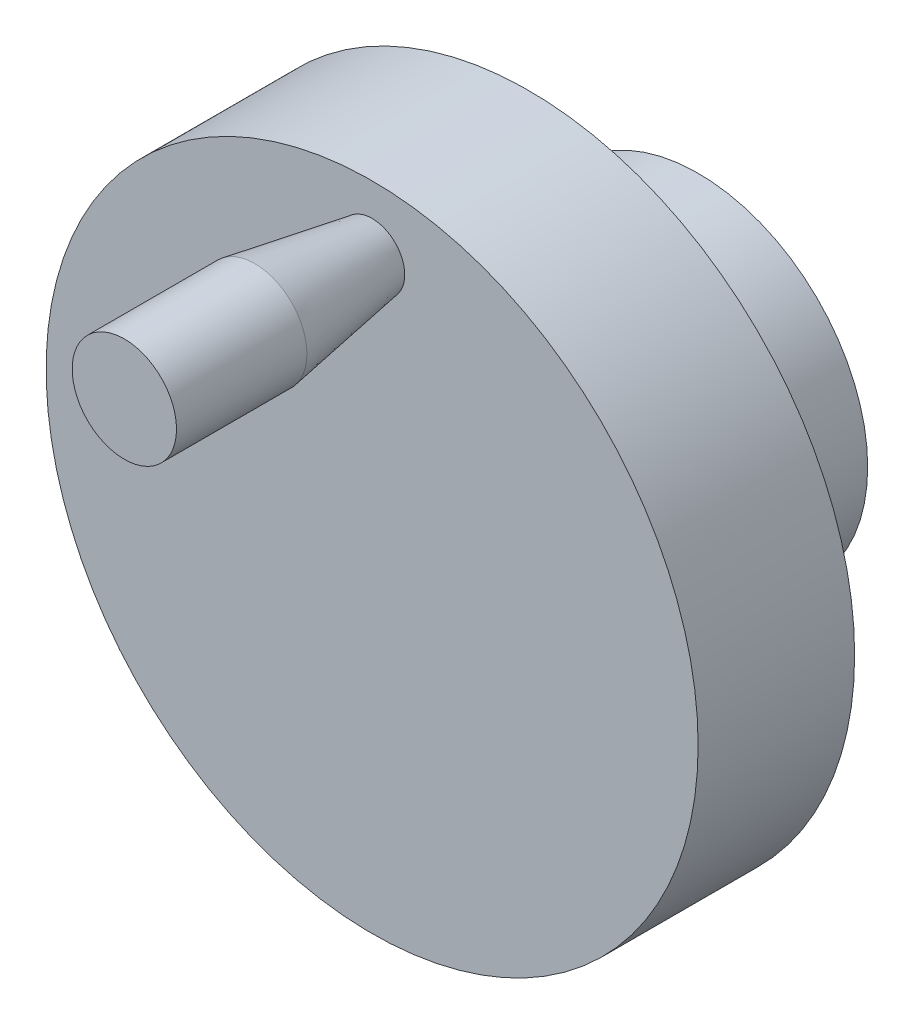
ISO-10303-21;
HEADER;
FILE_DESCRIPTION(('STEP AP214'),'2;1');
FILE_NAME('part.step','',(''),(''),'','','');
FILE_SCHEMA(('AUTOMOTIVE_DESIGN { 1 0 10303 214 1 1 1 1 }'));
ENDSEC;
DATA;
#1=APPLICATION_CONTEXT('core data for automotive mechanical design processes');
#2=APPLICATION_PROTOCOL_DEFINITION('international standard','automotive_design',2000,#1);
#3=PRODUCT_CONTEXT('',#1,'mechanical');
#4=PRODUCT('Part','Part','',(#3));
#5=PRODUCT_RELATED_PRODUCT_CATEGORY('part','',(#4));
#6=PRODUCT_DEFINITION_FORMATION('','',#4);
#7=PRODUCT_DEFINITION_CONTEXT('part definition',#1,'design');
#8=PRODUCT_DEFINITION('design','',#6,#7);
#9=PRODUCT_DEFINITION_SHAPE('','',#8);
#10=(LENGTH_UNIT() NAMED_UNIT(*) SI_UNIT(.MILLI.,.METRE.));
#11=(NAMED_UNIT(*) PLANE_ANGLE_UNIT() SI_UNIT($,.RADIAN.));
#12=(NAMED_UNIT(*) SI_UNIT($,.STERADIAN.) SOLID_ANGLE_UNIT());
#13=UNCERTAINTY_MEASURE_WITH_UNIT(LENGTH_MEASURE(1.E-05),#10,'distance_accuracy_value','');
#14=(GEOMETRIC_REPRESENTATION_CONTEXT(3) GLOBAL_UNCERTAINTY_ASSIGNED_CONTEXT((#13)) GLOBAL_UNIT_ASSIGNED_CONTEXT((#10,
#11,#12)) REPRESENTATION_CONTEXT('',''));
#15=CARTESIAN_POINT('',(0.,0.,0.));
#16=DIRECTION('',(0.,0.,1.));
#17=DIRECTION('',(1.,0.,0.));
#18=AXIS2_PLACEMENT_3D('',#15,#16,#17);
#19=CARTESIAN_POINT('',(0.,0.,12.));
#20=DIRECTION('',(0.,0.,-1.));
#21=DIRECTION('',(-1.,0.,0.));
#22=AXIS2_PLACEMENT_3D('',#19,#20,#21);
#23=CYLINDRICAL_SURFACE('',#22,25.);
#24=CARTESIAN_POINT('',(0.,0.,12.));
#25=DIRECTION('',(0.,0.,1.));
#26=DIRECTION('',(1.,0.,0.));
#27=AXIS2_PLACEMENT_3D('',#24,#25,#26);
#28=CIRCLE('',#27,25.);
#29=CARTESIAN_POINT('',(25.,0.,12.));
#30=VERTEX_POINT('',#29);
#31=EDGE_CURVE('E38',#30,#30,#28,.T.);
#32=ORIENTED_EDGE('',*,*,#31,.F.);
#33=EDGE_LOOP('',(#32));
#34=FACE_BOUND('',#33,.T.);
#35=CARTESIAN_POINT('',(0.,0.,0.));
#36=DIRECTION('',(0.,0.,1.));
#37=DIRECTION('',(1.,0.,0.));
#38=AXIS2_PLACEMENT_3D('',#35,#36,#37);
#39=CIRCLE('',#38,25.);
#40=CARTESIAN_POINT('',(25.,0.,0.));
#41=VERTEX_POINT('',#40);
#42=EDGE_CURVE('E34',#41,#41,#39,.T.);
#43=ORIENTED_EDGE('',*,*,#42,.T.);
#44=EDGE_LOOP('',(#43));
#45=FACE_BOUND('',#44,.T.);
#46=ADVANCED_FACE('F31',(#34,#45),#23,.T.);
#47=CARTESIAN_POINT('',(0.,0.,12.));
#48=DIRECTION('',(0.,0.,1.));
#49=DIRECTION('',(1.,0.,0.));
#50=AXIS2_PLACEMENT_3D('',#47,#48,#49);
#51=PLANE('',#50);
#52=CARTESIAN_POINT('',(0.,20.,12.));
#53=DIRECTION('',(0.,0.,1.));
#54=DIRECTION('',(1.,0.,0.));
#55=AXIS2_PLACEMENT_3D('',#52,#53,#54);
#56=CIRCLE('',#55,2.5);
#57=CARTESIAN_POINT('',(2.5,20.,12.));
#58=VERTEX_POINT('',#57);
#59=EDGE_CURVE('E53',#58,#58,#56,.T.);
#60=ORIENTED_EDGE('',*,*,#59,.F.);
#61=EDGE_LOOP('',(#60));
#62=FACE_BOUND('',#61,.T.);
#63=ORIENTED_EDGE('',*,*,#31,.T.);
#64=EDGE_LOOP('',(#63));
#65=FACE_BOUND('',#64,.T.);
#66=ADVANCED_FACE('F78',(#62,#65),#51,.T.);
#67=CARTESIAN_POINT('',(0.,0.,0.));
#68=DIRECTION('',(0.,0.,1.));
#69=DIRECTION('',(1.,0.,0.));
#70=AXIS2_PLACEMENT_3D('',#67,#68,#69);
#71=PLANE('',#70);
#72=CARTESIAN_POINT('',(0.,0.,0.));
#73=DIRECTION('',(0.,0.,-1.));
#74=DIRECTION('',(-1.,0.,0.));
#75=AXIS2_PLACEMENT_3D('',#72,#73,#74);
#76=CIRCLE('',#75,13.);
#77=CARTESIAN_POINT('',(13.,0.,0.));
#78=VERTEX_POINT('',#77);
#79=EDGE_CURVE('E10',#78,#78,#76,.T.);
#80=ORIENTED_EDGE('',*,*,#79,.F.);
#81=EDGE_LOOP('',(#80));
#82=FACE_BOUND('',#81,.T.);
#83=ORIENTED_EDGE('',*,*,#42,.F.);
#84=EDGE_LOOP('',(#83));
#85=FACE_BOUND('',#84,.T.);
#86=ADVANCED_FACE('F81',(#82,#85),#71,.F.);
#87=CARTESIAN_POINT('',(0.,0.,-13.));
#88=DIRECTION('',(0.,0.,1.));
#89=DIRECTION('',(1.,0.,0.));
#90=AXIS2_PLACEMENT_3D('',#87,#88,#89);
#91=CYLINDRICAL_SURFACE('',#90,13.);
#92=CARTESIAN_POINT('',(0.,0.,-13.));
#93=DIRECTION('',(0.,0.,-1.));
#94=DIRECTION('',(-1.,0.,0.));
#95=AXIS2_PLACEMENT_3D('',#92,#93,#94);
#96=CIRCLE('',#95,13.);
#97=CARTESIAN_POINT('',(13.,0.,-13.));
#98=VERTEX_POINT('',#97);
#99=EDGE_CURVE('E44',#98,#98,#96,.T.);
#100=CARTESIAN_POINT('',(13.,0.,-13.));
#101=CARTESIAN_POINT('',(13.,0.,-12.8645833333333));
#102=CARTESIAN_POINT('',(13.,0.,-12.7291666666667));
#103=CARTESIAN_POINT('',(13.,0.,-12.4583333333333));
#104=CARTESIAN_POINT('',(13.,0.,-12.3229166666667));
#105=CARTESIAN_POINT('',(13.,0.,-12.0520833333333));
#106=CARTESIAN_POINT('',(13.,0.,-11.9166666666667));
#107=CARTESIAN_POINT('',(13.,0.,-11.6458333333333));
#108=CARTESIAN_POINT('',(13.,0.,-11.5104166666667));
#109=CARTESIAN_POINT('',(13.,0.,-11.2395833333333));
#110=CARTESIAN_POINT('',(13.,0.,-11.1041666666667));
#111=CARTESIAN_POINT('',(13.,0.,-10.8333333333333));
#112=CARTESIAN_POINT('',(13.,0.,-10.6979166666667));
#113=CARTESIAN_POINT('',(13.,0.,-10.4270833333333));
#114=CARTESIAN_POINT('',(13.,0.,-10.2916666666667));
#115=CARTESIAN_POINT('',(13.,0.,-10.0208333333333));
#116=CARTESIAN_POINT('',(13.,0.,-9.88541666666667));
#117=CARTESIAN_POINT('',(13.,0.,-9.61458333333333));
#118=CARTESIAN_POINT('',(13.,0.,-9.47916666666667));
#119=CARTESIAN_POINT('',(13.,0.,-9.20833333333333));
#120=CARTESIAN_POINT('',(13.,0.,-9.07291666666667));
#121=CARTESIAN_POINT('',(13.,0.,-8.80208333333333));
#122=CARTESIAN_POINT('',(13.,0.,-8.66666666666667));
#123=CARTESIAN_POINT('',(13.,0.,-8.39583333333333));
#124=CARTESIAN_POINT('',(13.,0.,-8.26041666666667));
#125=CARTESIAN_POINT('',(13.,0.,-7.98958333333333));
#126=CARTESIAN_POINT('',(13.,0.,-7.85416666666667));
#127=CARTESIAN_POINT('',(13.,0.,-7.58333333333333));
#128=CARTESIAN_POINT('',(13.,0.,-7.44791666666667));
#129=CARTESIAN_POINT('',(13.,0.,-7.17708333333333));
#130=CARTESIAN_POINT('',(13.,0.,-7.04166666666667));
#131=CARTESIAN_POINT('',(13.,0.,-6.77083333333333));
#132=CARTESIAN_POINT('',(13.,0.,-6.63541666666667));
#133=CARTESIAN_POINT('',(13.,0.,-6.36458333333333));
#134=CARTESIAN_POINT('',(13.,0.,-6.22916666666667));
#135=CARTESIAN_POINT('',(13.,0.,-5.95833333333333));
#136=CARTESIAN_POINT('',(13.,0.,-5.82291666666667));
#137=CARTESIAN_POINT('',(13.,0.,-5.55208333333333));
#138=CARTESIAN_POINT('',(13.,0.,-5.41666666666667));
#139=CARTESIAN_POINT('',(13.,0.,-5.14583333333333));
#140=CARTESIAN_POINT('',(13.,0.,-5.01041666666667));
#141=CARTESIAN_POINT('',(13.,0.,-4.73958333333333));
#142=CARTESIAN_POINT('',(13.,0.,-4.60416666666667));
#143=CARTESIAN_POINT('',(13.,0.,-4.33333333333333));
#144=CARTESIAN_POINT('',(13.,0.,-4.19791666666667));
#145=CARTESIAN_POINT('',(13.,0.,-3.92708333333333));
#146=CARTESIAN_POINT('',(13.,0.,-3.79166666666667));
#147=CARTESIAN_POINT('',(13.,0.,-3.52083333333333));
#148=CARTESIAN_POINT('',(13.,0.,-3.38541666666667));
#149=CARTESIAN_POINT('',(13.,0.,-3.11458333333333));
#150=CARTESIAN_POINT('',(13.,0.,-2.97916666666667));
#151=CARTESIAN_POINT('',(13.,0.,-2.70833333333333));
#152=CARTESIAN_POINT('',(13.,0.,-2.57291666666667));
#153=CARTESIAN_POINT('',(13.,0.,-2.30208333333333));
#154=CARTESIAN_POINT('',(13.,0.,-2.16666666666667));
#155=CARTESIAN_POINT('',(13.,0.,-1.89583333333333));
#156=CARTESIAN_POINT('',(13.,0.,-1.76041666666667));
#157=CARTESIAN_POINT('',(13.,0.,-1.48958333333333));
#158=CARTESIAN_POINT('',(13.,0.,-1.35416666666667));
#159=CARTESIAN_POINT('',(13.,0.,-1.08333333333333));
#160=CARTESIAN_POINT('',(13.,0.,-0.947916666666667));
#161=CARTESIAN_POINT('',(13.,0.,-0.677083333333334));
#162=CARTESIAN_POINT('',(13.,0.,-0.541666666666667));
#163=CARTESIAN_POINT('',(13.,0.,-0.270833333333334));
#164=CARTESIAN_POINT('',(13.,0.,-0.135416666666667));
#165=CARTESIAN_POINT('',(13.,0.,0.));
#166=B_SPLINE_CURVE_WITH_KNOTS('',3,(#100,#101,#102,#103,#104,#105,#106,#107,#108,#109,#110,
#111,#112,#113,#114,#115,#116,#117,#118,#119,#120,#121,#122,#123,#124,#125,#126,#127,#128,#129,
#130,#131,#132,#133,#134,#135,#136,#137,#138,#139,#140,#141,#142,#143,#144,#145,#146,#147,#148,
#149,#150,#151,#152,#153,#154,#155,#156,#157,#158,#159,#160,#161,#162,#163,#164,#165),
.UNSPECIFIED.,.F.,.F.,(4,2,2,2,2,2,2,2,2,2,2,2,2,2,2,2,2,2,2,2,2,2,2,2,2,2,2,2,2,2,2,2,4),(0.,
0.406249999999999,0.812499999999999,1.21875,1.625,2.03125,2.4375,2.84375,3.25,3.65625,4.0625,
4.46875,4.875,5.28125,5.6875,6.09375,6.5,6.90625,7.3125,7.71875,8.125,8.53125,8.9375,9.34375,
9.75,10.15625,10.5625,10.96875,11.375,11.78125,12.1875,12.59375,13.),.UNSPECIFIED.);
#167=EDGE_CURVE('BSEAM91',#98,#78,#166,.T.);
#168=ORIENTED_EDGE('',*,*,#99,.F.);
#169=ORIENTED_EDGE('',*,*,#79,.T.);
#170=ORIENTED_EDGE('',*,*,#167,.T.);
#171=ORIENTED_EDGE('',*,*,#167,.F.);
#172=EDGE_LOOP('',(#168,#170,#169,#171));
#173=FACE_BOUND('',#172,.T.);
#174=ADVANCED_FACE('F91',(#173),#91,.T.);
#175=CARTESIAN_POINT('',(0.,0.,-13.));
#176=DIRECTION('',(0.,0.,-1.));
#177=DIRECTION('',(-1.,0.,0.));
#178=AXIS2_PLACEMENT_3D('',#175,#176,#177);
#179=PLANE('',#178);
#180=CARTESIAN_POINT('',(0.,0.,-13.));
#181=DIRECTION('',(0.,0.,-1.));
#182=DIRECTION('',(-1.,0.,0.));
#183=AXIS2_PLACEMENT_3D('',#180,#181,#182);
#184=CIRCLE('',#183,4.);
#185=CARTESIAN_POINT('',(-4.,0.,-13.));
#186=VERTEX_POINT('',#185);
#187=EDGE_CURVE('E50',#186,#186,#184,.T.);
#188=ORIENTED_EDGE('',*,*,#187,.F.);
#189=EDGE_LOOP('',(#188));
#190=FACE_BOUND('',#189,.T.);
#191=ORIENTED_EDGE('',*,*,#99,.T.);
#192=EDGE_LOOP('',(#191));
#193=FACE_BOUND('',#192,.T.);
#194=ADVANCED_FACE('F96',(#190,#193),#179,.T.);
#195=CARTESIAN_POINT('',(0.,0.,0.));
#196=DIRECTION('',(0.,0.,1.));
#197=DIRECTION('',(1.,0.,0.));
#198=AXIS2_PLACEMENT_3D('',#195,#196,#197);
#199=PLANE('',#198);
#200=CARTESIAN_POINT('',(0.,0.,0.));
#201=DIRECTION('',(0.,0.,1.));
#202=DIRECTION('',(1.,0.,0.));
#203=AXIS2_PLACEMENT_3D('',#200,#201,#202);
#204=CIRCLE('',#203,4.);
#205=CARTESIAN_POINT('',(4.,0.,0.));
#206=VERTEX_POINT('',#205);
#207=EDGE_CURVE('E47',#206,#206,#204,.F.);
#208=ORIENTED_EDGE('',*,*,#207,.T.);
#209=EDGE_LOOP('',(#208));
#210=FACE_BOUND('',#209,.T.);
#211=ADVANCED_FACE('F102',(#210),#199,.F.);
#212=CARTESIAN_POINT('',(0.,0.,11.3137084989848));
#213=DIRECTION('',(0.,0.,-1.));
#214=DIRECTION('',(-1.,0.,0.));
#215=AXIS2_PLACEMENT_3D('',#212,#213,#214);
#216=CYLINDRICAL_SURFACE('',#215,4.);
#217=ORIENTED_EDGE('',*,*,#187,.T.);
#218=EDGE_LOOP('',(#217));
#219=FACE_BOUND('',#218,.T.);
#220=ORIENTED_EDGE('',*,*,#207,.F.);
#221=EDGE_LOOP('',(#220));
#222=FACE_BOUND('',#221,.T.);
#223=ADVANCED_FACE('F74',(#219,#222),#216,.F.);
#224=CARTESIAN_POINT('',(0.,20.,12.));
#225=DIRECTION('',(0.,0.,1.));
#226=DIRECTION('',(1.,0.,0.));
#227=AXIS2_PLACEMENT_3D('',#224,#225,#226);
#228=CONICAL_SURFACE('',#227,2.5,0.165148677414627);
#229=CARTESIAN_POINT('',(0.,20.,21.));
#230=DIRECTION('',(0.,0.,1.));
#231=DIRECTION('',(1.,0.,0.));
#232=AXIS2_PLACEMENT_3D('',#229,#230,#231);
#233=CIRCLE('',#232,4.);
#234=CARTESIAN_POINT('',(4.,20.,21.));
#235=VERTEX_POINT('',#234);
#236=EDGE_CURVE('E56',#235,#235,#233,.T.);
#237=ORIENTED_EDGE('',*,*,#236,.F.);
#238=EDGE_LOOP('',(#237));
#239=FACE_BOUND('',#238,.T.);
#240=ORIENTED_EDGE('',*,*,#59,.T.);
#241=EDGE_LOOP('',(#240));
#242=FACE_BOUND('',#241,.T.);
#243=ADVANCED_FACE('F68',(#239,#242),#228,.T.);
#244=CARTESIAN_POINT('',(0.,20.,31.));
#245=DIRECTION('',(0.,0.,1.));
#246=DIRECTION('',(1.,0.,0.));
#247=AXIS2_PLACEMENT_3D('',#244,#245,#246);
#248=CYLINDRICAL_SURFACE('',#247,4.);
#249=CARTESIAN_POINT('',(0.,20.,31.));
#250=DIRECTION('',(0.,0.,1.));
#251=DIRECTION('',(1.,0.,0.));
#252=AXIS2_PLACEMENT_3D('',#249,#250,#251);
#253=CIRCLE('',#252,4.);
#254=CARTESIAN_POINT('',(4.,20.,31.));
#255=VERTEX_POINT('',#254);
#256=EDGE_CURVE('E59',#255,#255,#253,.T.);
#257=ORIENTED_EDGE('',*,*,#256,.F.);
#258=EDGE_LOOP('',(#257));
#259=FACE_BOUND('',#258,.T.);
#260=ORIENTED_EDGE('',*,*,#236,.T.);
#261=EDGE_LOOP('',(#260));
#262=FACE_BOUND('',#261,.T.);
#263=ADVANCED_FACE('F65',(#259,#262),#248,.T.);
#264=CARTESIAN_POINT('',(0.,24.,31.));
#265=DIRECTION('',(0.,0.,-1.));
#266=DIRECTION('',(-1.,0.,0.));
#267=AXIS2_PLACEMENT_3D('',#264,#265,#266);
#268=PLANE('',#267);
#269=ORIENTED_EDGE('',*,*,#256,.T.);
#270=EDGE_LOOP('',(#269));
#271=FACE_BOUND('',#270,.T.);
#272=ADVANCED_FACE('F63',(#271),#268,.F.);
#273=CLOSED_SHELL('',(#46,#66,#86,#174,#194,#211,#223,#243,#263,#272));
#274=MANIFOLD_SOLID_BREP('B2',#273);
#275=ADVANCED_BREP_SHAPE_REPRESENTATION('',(#18,#274),#14);
#276=SHAPE_DEFINITION_REPRESENTATION(#9,#275);
ENDSEC;
END-ISO-10303-21;
